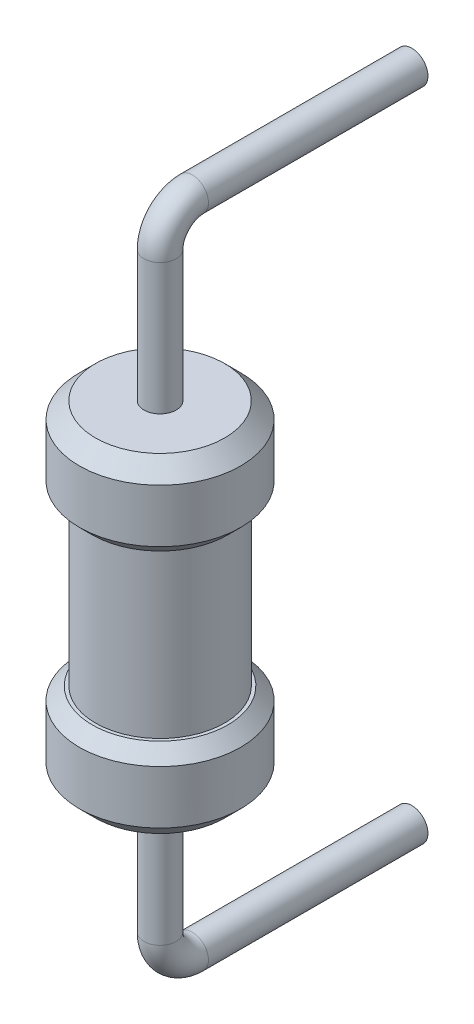
ISO-10303-21;
HEADER;
FILE_DESCRIPTION(('STEP AP214'),'2;1');
FILE_NAME('part.step','',(''),(''),'','','');
FILE_SCHEMA(('AUTOMOTIVE_DESIGN { 1 0 10303 214 1 1 1 1 }'));
ENDSEC;
DATA;
#1=APPLICATION_CONTEXT('core data for automotive mechanical design processes');
#2=APPLICATION_PROTOCOL_DEFINITION('international standard','automotive_design',2000,#1);
#3=PRODUCT_CONTEXT('',#1,'mechanical');
#4=PRODUCT('Part','Part','',(#3));
#5=PRODUCT_RELATED_PRODUCT_CATEGORY('part','',(#4));
#6=PRODUCT_DEFINITION_FORMATION('','',#4);
#7=PRODUCT_DEFINITION_CONTEXT('part definition',#1,'design');
#8=PRODUCT_DEFINITION('design','',#6,#7);
#9=PRODUCT_DEFINITION_SHAPE('','',#8);
#10=(LENGTH_UNIT() NAMED_UNIT(*) SI_UNIT(.MILLI.,.METRE.));
#11=(NAMED_UNIT(*) PLANE_ANGLE_UNIT() SI_UNIT($,.RADIAN.));
#12=(NAMED_UNIT(*) SI_UNIT($,.STERADIAN.) SOLID_ANGLE_UNIT());
#13=UNCERTAINTY_MEASURE_WITH_UNIT(LENGTH_MEASURE(1.E-05),#10,'distance_accuracy_value','');
#14=(GEOMETRIC_REPRESENTATION_CONTEXT(3) GLOBAL_UNCERTAINTY_ASSIGNED_CONTEXT((#13)) GLOBAL_UNIT_ASSIGNED_CONTEXT((#10,
#11,#12)) REPRESENTATION_CONTEXT('',''));
#15=CARTESIAN_POINT('',(0.,0.,0.));
#16=DIRECTION('',(0.,0.,1.));
#17=DIRECTION('',(1.,0.,0.));
#18=AXIS2_PLACEMENT_3D('',#15,#16,#17);
#19=CARTESIAN_POINT('',(0.25,-5.08,-3.4));
#20=DIRECTION('',(0.,0.,1.));
#21=DIRECTION('',(0.,-1.,0.));
#22=AXIS2_PLACEMENT_3D('',#19,#20,#21);
#23=PLANE('',#22);
#24=CARTESIAN_POINT('',(0.,-5.08,-3.4));
#25=DIRECTION('',(0.,0.,1.));
#26=DIRECTION('',(0.,-1.,0.));
#27=AXIS2_PLACEMENT_3D('',#24,#25,#26);
#28=CIRCLE('',#27,0.25);
#29=CARTESIAN_POINT('',(0.,-5.33,-3.4));
#30=VERTEX_POINT('',#29);
#31=EDGE_CURVE('E18',#30,#30,#28,.T.);
#32=ORIENTED_EDGE('',*,*,#31,.F.);
#33=EDGE_LOOP('',(#32));
#34=FACE_BOUND('',#33,.T.);
#35=ADVANCED_FACE('F15',(#34),#23,.F.);
#36=CARTESIAN_POINT('',(0.25,5.08,-3.4));
#37=DIRECTION('',(0.,0.,1.));
#38=DIRECTION('',(0.,-1.,0.));
#39=AXIS2_PLACEMENT_3D('',#36,#37,#38);
#40=PLANE('',#39);
#41=CARTESIAN_POINT('',(0.,5.08,-3.4));
#42=DIRECTION('',(0.,0.,1.));
#43=DIRECTION('',(0.,-1.,0.));
#44=AXIS2_PLACEMENT_3D('',#41,#42,#43);
#45=CIRCLE('',#44,0.25);
#46=CARTESIAN_POINT('',(0.,4.83,-3.4));
#47=VERTEX_POINT('',#46);
#48=EDGE_CURVE('E52',#47,#47,#45,.T.);
#49=ORIENTED_EDGE('',*,*,#48,.F.);
#50=EDGE_LOOP('',(#49));
#51=FACE_BOUND('',#50,.T.);
#52=ADVANCED_FACE('F65',(#51),#40,.F.);
#53=CARTESIAN_POINT('',(0.,-5.08,0.));
#54=DIRECTION('',(0.,0.,1.));
#55=DIRECTION('',(0.,-1.,0.));
#56=AXIS2_PLACEMENT_3D('',#53,#54,#55);
#57=CYLINDRICAL_SURFACE('',#56,0.25);
#58=ORIENTED_EDGE('',*,*,#31,.T.);
#59=EDGE_LOOP('',(#58));
#60=FACE_BOUND('',#59,.T.);
#61=CARTESIAN_POINT('',(0.,-5.08,0.));
#62=DIRECTION('',(0.,0.,-1.));
#63=DIRECTION('',(1.,0.,0.));
#64=AXIS2_PLACEMENT_3D('',#61,#62,#63);
#65=CIRCLE('',#64,0.25);
#66=CARTESIAN_POINT('',(0.25,-5.08,0.));
#67=VERTEX_POINT('',#66);
#68=EDGE_CURVE('E30',#67,#67,#65,.T.);
#69=ORIENTED_EDGE('',*,*,#68,.T.);
#70=EDGE_LOOP('',(#69));
#71=FACE_BOUND('',#70,.T.);
#72=ADVANCED_FACE('F61',(#60,#71),#57,.T.);
#73=CARTESIAN_POINT('',(0.,5.08,0.));
#74=DIRECTION('',(0.,0.,1.));
#75=DIRECTION('',(0.,-1.,0.));
#76=AXIS2_PLACEMENT_3D('',#73,#74,#75);
#77=CYLINDRICAL_SURFACE('',#76,0.25);
#78=ORIENTED_EDGE('',*,*,#48,.T.);
#79=EDGE_LOOP('',(#78));
#80=FACE_BOUND('',#79,.T.);
#81=CARTESIAN_POINT('',(0.,5.08,0.));
#82=DIRECTION('',(0.,0.,1.));
#83=DIRECTION('',(1.,0.,0.));
#84=AXIS2_PLACEMENT_3D('',#81,#82,#83);
#85=CIRCLE('',#84,0.25);
#86=CARTESIAN_POINT('',(0.25,5.08,0.));
#87=VERTEX_POINT('',#86);
#88=EDGE_CURVE('E57',#87,#87,#85,.T.);
#89=ORIENTED_EDGE('',*,*,#88,.F.);
#90=EDGE_LOOP('',(#89));
#91=FACE_BOUND('',#90,.T.);
#92=ADVANCED_FACE('F178',(#80,#91),#77,.T.);
#93=CARTESIAN_POINT('',(0.,-4.58,0.));
#94=DIRECTION('',(-1.,0.,0.));
#95=DIRECTION('',(0.,0.,1.));
#96=AXIS2_PLACEMENT_3D('',#93,#94,#95);
#97=TOROIDAL_SURFACE('',#96,0.5,0.25);
#98=CARTESIAN_POINT('',(0.,-4.58,0.5));
#99=DIRECTION('',(0.,1.,0.));
#100=DIRECTION('',(0.,0.,1.));
#101=AXIS2_PLACEMENT_3D('',#98,#99,#100);
#102=CIRCLE('',#101,0.25);
#103=CARTESIAN_POINT('',(0.,-4.58,0.75));
#104=VERTEX_POINT('',#103);
#105=EDGE_CURVE('E136',#104,#104,#102,.T.);
#106=ORIENTED_EDGE('',*,*,#105,.F.);
#107=EDGE_LOOP('',(#106));
#108=FACE_BOUND('',#107,.T.);
#109=ORIENTED_EDGE('',*,*,#68,.F.);
#110=EDGE_LOOP('',(#109));
#111=FACE_BOUND('',#110,.T.);
#112=ADVANCED_FACE('F130',(#108,#111),#97,.T.);
#113=CARTESIAN_POINT('',(0.,4.58,0.));
#114=DIRECTION('',(1.,0.,0.));
#115=DIRECTION('',(0.,0.,1.));
#116=AXIS2_PLACEMENT_3D('',#113,#114,#115);
#117=TOROIDAL_SURFACE('',#116,0.5,0.25);
#118=CARTESIAN_POINT('',(0.,4.58,0.5));
#119=DIRECTION('',(0.,1.,0.));
#120=DIRECTION('',(0.,0.,1.));
#121=AXIS2_PLACEMENT_3D('',#118,#119,#120);
#122=CIRCLE('',#121,0.25);
#123=CARTESIAN_POINT('',(0.,4.58,0.75));
#124=VERTEX_POINT('',#123);
#125=EDGE_CURVE('E51',#124,#124,#122,.F.);
#126=ORIENTED_EDGE('',*,*,#125,.F.);
#127=EDGE_LOOP('',(#126));
#128=FACE_BOUND('',#127,.T.);
#129=ORIENTED_EDGE('',*,*,#88,.T.);
#130=EDGE_LOOP('',(#129));
#131=FACE_BOUND('',#130,.T.);
#132=ADVANCED_FACE('F125',(#128,#131),#117,.T.);
#133=CARTESIAN_POINT('',(0.,-2.55,0.5));
#134=DIRECTION('',(0.,1.,0.));
#135=DIRECTION('',(0.,0.,1.));
#136=AXIS2_PLACEMENT_3D('',#133,#134,#135);
#137=CYLINDRICAL_SURFACE('',#136,0.25);
#138=CARTESIAN_POINT('',(0.,-2.55,0.5));
#139=DIRECTION('',(0.,1.,0.));
#140=DIRECTION('',(0.,0.,1.));
#141=AXIS2_PLACEMENT_3D('',#138,#139,#140);
#142=CIRCLE('',#141,0.25);
#143=CARTESIAN_POINT('',(0.,-2.55,0.75));
#144=VERTEX_POINT('',#143);
#145=EDGE_CURVE('E49',#144,#144,#142,.F.);
#146=ORIENTED_EDGE('',*,*,#145,.T.);
#147=EDGE_LOOP('',(#146));
#148=FACE_BOUND('',#147,.T.);
#149=ORIENTED_EDGE('',*,*,#105,.T.);
#150=EDGE_LOOP('',(#149));
#151=FACE_BOUND('',#150,.T.);
#152=ADVANCED_FACE('F121',(#148,#151),#137,.T.);
#153=CARTESIAN_POINT('',(0.,4.58,0.5));
#154=DIRECTION('',(0.,1.,0.));
#155=DIRECTION('',(0.,0.,1.));
#156=AXIS2_PLACEMENT_3D('',#153,#154,#155);
#157=CYLINDRICAL_SURFACE('',#156,0.25);
#158=ORIENTED_EDGE('',*,*,#125,.T.);
#159=EDGE_LOOP('',(#158));
#160=FACE_BOUND('',#159,.T.);
#161=CARTESIAN_POINT('',(0.,2.55,0.5));
#162=DIRECTION('',(0.,1.,0.));
#163=DIRECTION('',(0.,0.,1.));
#164=AXIS2_PLACEMENT_3D('',#161,#162,#163);
#165=CIRCLE('',#164,0.25);
#166=CARTESIAN_POINT('',(0.,2.55,0.75));
#167=VERTEX_POINT('',#166);
#168=EDGE_CURVE('E46',#167,#167,#165,.F.);
#169=ORIENTED_EDGE('',*,*,#168,.F.);
#170=EDGE_LOOP('',(#169));
#171=FACE_BOUND('',#170,.T.);
#172=ADVANCED_FACE('F117',(#160,#171),#157,.T.);
#173=CARTESIAN_POINT('',(1.25,-2.55,0.5));
#174=DIRECTION('',(0.,1.,0.));
#175=DIRECTION('',(0.,0.,1.));
#176=AXIS2_PLACEMENT_3D('',#173,#174,#175);
#177=PLANE('',#176);
#178=ORIENTED_EDGE('',*,*,#145,.F.);
#179=EDGE_LOOP('',(#178));
#180=FACE_BOUND('',#179,.T.);
#181=CARTESIAN_POINT('',(0.,-2.55000000004202,0.5));
#182=DIRECTION('',(0.,1.,0.));
#183=DIRECTION('',(-1.,0.,0.));
#184=AXIS2_PLACEMENT_3D('',#181,#182,#183);
#185=CIRCLE('',#184,0.999999999976354);
#186=CARTESIAN_POINT('',(-0.999999999976354,-2.55000000004202,0.5));
#187=VERTEX_POINT('',#186);
#188=EDGE_CURVE('E43',#187,#187,#185,.T.);
#189=ORIENTED_EDGE('',*,*,#188,.F.);
#190=EDGE_LOOP('',(#189));
#191=FACE_BOUND('',#190,.T.);
#192=ADVANCED_FACE('F113',(#180,#191),#177,.F.);
#193=CARTESIAN_POINT('',(1.25,2.55,0.5));
#194=DIRECTION('',(0.,1.,0.));
#195=DIRECTION('',(0.,0.,1.));
#196=AXIS2_PLACEMENT_3D('',#193,#194,#195);
#197=PLANE('',#196);
#198=ORIENTED_EDGE('',*,*,#168,.T.);
#199=EDGE_LOOP('',(#198));
#200=FACE_BOUND('',#199,.T.);
#201=CARTESIAN_POINT('',(0.,2.54999999998518,0.5));
#202=DIRECTION('',(0.,-1.,0.));
#203=DIRECTION('',(1.,0.,0.));
#204=AXIS2_PLACEMENT_3D('',#201,#202,#203);
#205=CIRCLE('',#204,1.0000000000332);
#206=CARTESIAN_POINT('',(1.0000000000332,2.54999999998518,0.5));
#207=VERTEX_POINT('',#206);
#208=EDGE_CURVE('E39',#207,#207,#205,.T.);
#209=ORIENTED_EDGE('',*,*,#208,.F.);
#210=EDGE_LOOP('',(#209));
#211=FACE_BOUND('',#210,.T.);
#212=ADVANCED_FACE('F109',(#200,#211),#197,.T.);
#213=CARTESIAN_POINT('',(0.,-2.29999999999109,0.5));
#214=DIRECTION('',(0.,1.,0.));
#215=DIRECTION('',(-1.,0.,0.));
#216=AXIS2_PLACEMENT_3D('',#213,#214,#215);
#217=CONICAL_SURFACE('',#216,1.25000000002729,0.785398163397447);
#218=CARTESIAN_POINT('',(0.,-2.3,0.5));
#219=DIRECTION('',(0.,1.,0.));
#220=DIRECTION('',(0.,0.,1.));
#221=AXIS2_PLACEMENT_3D('',#218,#219,#220);
#222=CIRCLE('',#221,1.25);
#223=CARTESIAN_POINT('',(0.,-2.3,1.75));
#224=VERTEX_POINT('',#223);
#225=EDGE_CURVE('E42',#224,#224,#222,.T.);
#226=ORIENTED_EDGE('',*,*,#225,.F.);
#227=EDGE_LOOP('',(#226));
#228=FACE_BOUND('',#227,.T.);
#229=ORIENTED_EDGE('',*,*,#188,.T.);
#230=EDGE_LOOP('',(#229));
#231=FACE_BOUND('',#230,.T.);
#232=ADVANCED_FACE('F105',(#228,#231),#217,.T.);
#233=CARTESIAN_POINT('',(0.,2.30000000010477,0.5));
#234=DIRECTION('',(0.,-1.,0.));
#235=DIRECTION('',(1.,0.,0.));
#236=AXIS2_PLACEMENT_3D('',#233,#234,#235);
#237=CONICAL_SURFACE('',#236,1.2499999999136,0.785398163397448);
#238=ORIENTED_EDGE('',*,*,#208,.T.);
#239=EDGE_LOOP('',(#238));
#240=FACE_BOUND('',#239,.T.);
#241=CARTESIAN_POINT('',(0.,2.3,0.5));
#242=DIRECTION('',(0.,1.,0.));
#243=DIRECTION('',(0.,0.,1.));
#244=AXIS2_PLACEMENT_3D('',#241,#242,#243);
#245=CIRCLE('',#244,1.25);
#246=CARTESIAN_POINT('',(0.,2.3,1.75));
#247=VERTEX_POINT('',#246);
#248=EDGE_CURVE('E151',#247,#247,#245,.F.);
#249=ORIENTED_EDGE('',*,*,#248,.F.);
#250=EDGE_LOOP('',(#249));
#251=FACE_BOUND('',#250,.T.);
#252=ADVANCED_FACE('F101',(#240,#251),#237,.T.);
#253=CARTESIAN_POINT('',(0.,-1.275,0.5));
#254=DIRECTION('',(0.,1.,0.));
#255=DIRECTION('',(0.,0.,1.));
#256=AXIS2_PLACEMENT_3D('',#253,#254,#255);
#257=CYLINDRICAL_SURFACE('',#256,1.25);
#258=ORIENTED_EDGE('',*,*,#225,.T.);
#259=EDGE_LOOP('',(#258));
#260=FACE_BOUND('',#259,.T.);
#261=CARTESIAN_POINT('',(0.,-1.47500000002765,0.5));
#262=DIRECTION('',(0.,-1.,0.));
#263=DIRECTION('',(1.,0.,0.));
#264=AXIS2_PLACEMENT_3D('',#261,#262,#263);
#265=CIRCLE('',#264,1.24999999997044);
#266=CARTESIAN_POINT('',(1.24999999997044,-1.47500000002765,0.5));
#267=VERTEX_POINT('',#266);
#268=EDGE_CURVE('E148',#267,#267,#265,.F.);
#269=ORIENTED_EDGE('',*,*,#268,.F.);
#270=EDGE_LOOP('',(#269));
#271=FACE_BOUND('',#270,.T.);
#272=ADVANCED_FACE('F97',(#260,#271),#257,.T.);
#273=CARTESIAN_POINT('',(0.,2.55,0.5));
#274=DIRECTION('',(0.,1.,0.));
#275=DIRECTION('',(0.,0.,1.));
#276=AXIS2_PLACEMENT_3D('',#273,#274,#275);
#277=CYLINDRICAL_SURFACE('',#276,1.25);
#278=CARTESIAN_POINT('',(0.,1.47500000002765,0.5));
#279=DIRECTION('',(0.,1.,0.));
#280=DIRECTION('',(1.,0.,0.));
#281=AXIS2_PLACEMENT_3D('',#278,#279,#280);
#282=CIRCLE('',#281,1.25000000008413);
#283=CARTESIAN_POINT('',(1.25000000008413,1.47500000002765,0.5));
#284=VERTEX_POINT('',#283);
#285=EDGE_CURVE('E38',#284,#284,#282,.F.);
#286=ORIENTED_EDGE('',*,*,#285,.F.);
#287=EDGE_LOOP('',(#286));
#288=FACE_BOUND('',#287,.T.);
#289=ORIENTED_EDGE('',*,*,#248,.T.);
#290=EDGE_LOOP('',(#289));
#291=FACE_BOUND('',#290,.T.);
#292=ADVANCED_FACE('F93',(#288,#291),#277,.T.);
#293=CARTESIAN_POINT('',(0.,-1.47500000002765,0.5));
#294=DIRECTION('',(0.,-1.,0.));
#295=DIRECTION('',(0.,0.,-1.));
#296=AXIS2_PLACEMENT_3D('',#293,#294,#295);
#297=CONICAL_SURFACE('',#296,1.24999999997044,0.785398163397448);
#298=CARTESIAN_POINT('',(0.,-1.27499999996417,0.5));
#299=DIRECTION('',(0.,-1.,0.));
#300=DIRECTION('',(0.,0.,-1.));
#301=AXIS2_PLACEMENT_3D('',#298,#299,#300);
#302=CIRCLE('',#301,1.04999999990696);
#303=CARTESIAN_POINT('',(0.,-1.27499999996417,-0.549999999906959));
#304=VERTEX_POINT('',#303);
#305=EDGE_CURVE('E35',#304,#304,#302,.F.);
#306=ORIENTED_EDGE('',*,*,#305,.F.);
#307=EDGE_LOOP('',(#306));
#308=FACE_BOUND('',#307,.T.);
#309=ORIENTED_EDGE('',*,*,#268,.T.);
#310=EDGE_LOOP('',(#309));
#311=FACE_BOUND('',#310,.T.);
#312=ADVANCED_FACE('F89',(#308,#311),#297,.T.);
#313=CARTESIAN_POINT('',(0.,1.47500000002765,0.5));
#314=DIRECTION('',(0.,1.,0.));
#315=DIRECTION('',(0.,0.,1.));
#316=AXIS2_PLACEMENT_3D('',#313,#314,#315);
#317=CONICAL_SURFACE('',#316,1.25000000008413,0.785398163397448);
#318=ORIENTED_EDGE('',*,*,#285,.T.);
#319=EDGE_LOOP('',(#318));
#320=FACE_BOUND('',#319,.T.);
#321=CARTESIAN_POINT('',(0.,1.27499999996417,0.5));
#322=DIRECTION('',(0.,1.,0.));
#323=DIRECTION('',(0.,0.,1.));
#324=AXIS2_PLACEMENT_3D('',#321,#322,#323);
#325=CIRCLE('',#324,1.05000000002065);
#326=CARTESIAN_POINT('',(0.,1.27499999996417,1.55000000002065));
#327=VERTEX_POINT('',#326);
#328=EDGE_CURVE('E27',#327,#327,#325,.T.);
#329=ORIENTED_EDGE('',*,*,#328,.T.);
#330=EDGE_LOOP('',(#329));
#331=FACE_BOUND('',#330,.T.);
#332=ADVANCED_FACE('F85',(#320,#331),#317,.T.);
#333=CARTESIAN_POINT('',(1.25,-1.275,0.5));
#334=DIRECTION('',(0.,1.,0.));
#335=DIRECTION('',(0.,0.,1.));
#336=AXIS2_PLACEMENT_3D('',#333,#334,#335);
#337=PLANE('',#336);
#338=CARTESIAN_POINT('',(0.,-1.275,0.500000000000001));
#339=DIRECTION('',(0.,1.,0.));
#340=DIRECTION('',(0.,0.,1.));
#341=AXIS2_PLACEMENT_3D('',#338,#339,#340);
#342=CIRCLE('',#341,1.);
#343=CARTESIAN_POINT('',(0.,-1.275,1.5));
#344=VERTEX_POINT('',#343);
#345=EDGE_CURVE('E22',#344,#344,#342,.T.);
#346=ORIENTED_EDGE('',*,*,#345,.F.);
#347=EDGE_LOOP('',(#346));
#348=FACE_BOUND('',#347,.T.);
#349=ORIENTED_EDGE('',*,*,#305,.T.);
#350=EDGE_LOOP('',(#349));
#351=FACE_BOUND('',#350,.T.);
#352=ADVANCED_FACE('F78',(#348,#351),#337,.T.);
#353=CARTESIAN_POINT('',(1.25,1.275,0.5));
#354=DIRECTION('',(0.,1.,0.));
#355=DIRECTION('',(0.,0.,1.));
#356=AXIS2_PLACEMENT_3D('',#353,#354,#355);
#357=PLANE('',#356);
#358=CARTESIAN_POINT('',(0.,1.275,0.5));
#359=DIRECTION('',(0.,1.,0.));
#360=DIRECTION('',(0.,0.,1.));
#361=AXIS2_PLACEMENT_3D('',#358,#359,#360);
#362=CIRCLE('',#361,1.);
#363=CARTESIAN_POINT('',(0.,1.275,1.5));
#364=VERTEX_POINT('',#363);
#365=EDGE_CURVE('E10',#364,#364,#362,.F.);
#366=ORIENTED_EDGE('',*,*,#365,.F.);
#367=EDGE_LOOP('',(#366));
#368=FACE_BOUND('',#367,.T.);
#369=ORIENTED_EDGE('',*,*,#328,.F.);
#370=EDGE_LOOP('',(#369));
#371=FACE_BOUND('',#370,.T.);
#372=ADVANCED_FACE('F73',(#368,#371),#357,.F.);
#373=CARTESIAN_POINT('',(0.,1.275,0.5));
#374=DIRECTION('',(0.,1.,0.));
#375=DIRECTION('',(0.,0.,1.));
#376=AXIS2_PLACEMENT_3D('',#373,#374,#375);
#377=CYLINDRICAL_SURFACE('',#376,1.);
#378=ORIENTED_EDGE('',*,*,#365,.T.);
#379=EDGE_LOOP('',(#378));
#380=FACE_BOUND('',#379,.T.);
#381=ORIENTED_EDGE('',*,*,#345,.T.);
#382=EDGE_LOOP('',(#381));
#383=FACE_BOUND('',#382,.T.);
#384=ADVANCED_FACE('F71',(#380,#383),#377,.T.);
#385=CLOSED_SHELL('',(#35,#52,#72,#92,#112,#132,#152,#172,#192,#212,#232,#252,#272,#292,#312,
#332,#352,#372,#384));
#386=MANIFOLD_SOLID_BREP('B1',#385);
#387=ADVANCED_BREP_SHAPE_REPRESENTATION('',(#18,#386),#14);
#388=SHAPE_DEFINITION_REPRESENTATION(#9,#387);
ENDSEC;
END-ISO-10303-21;
